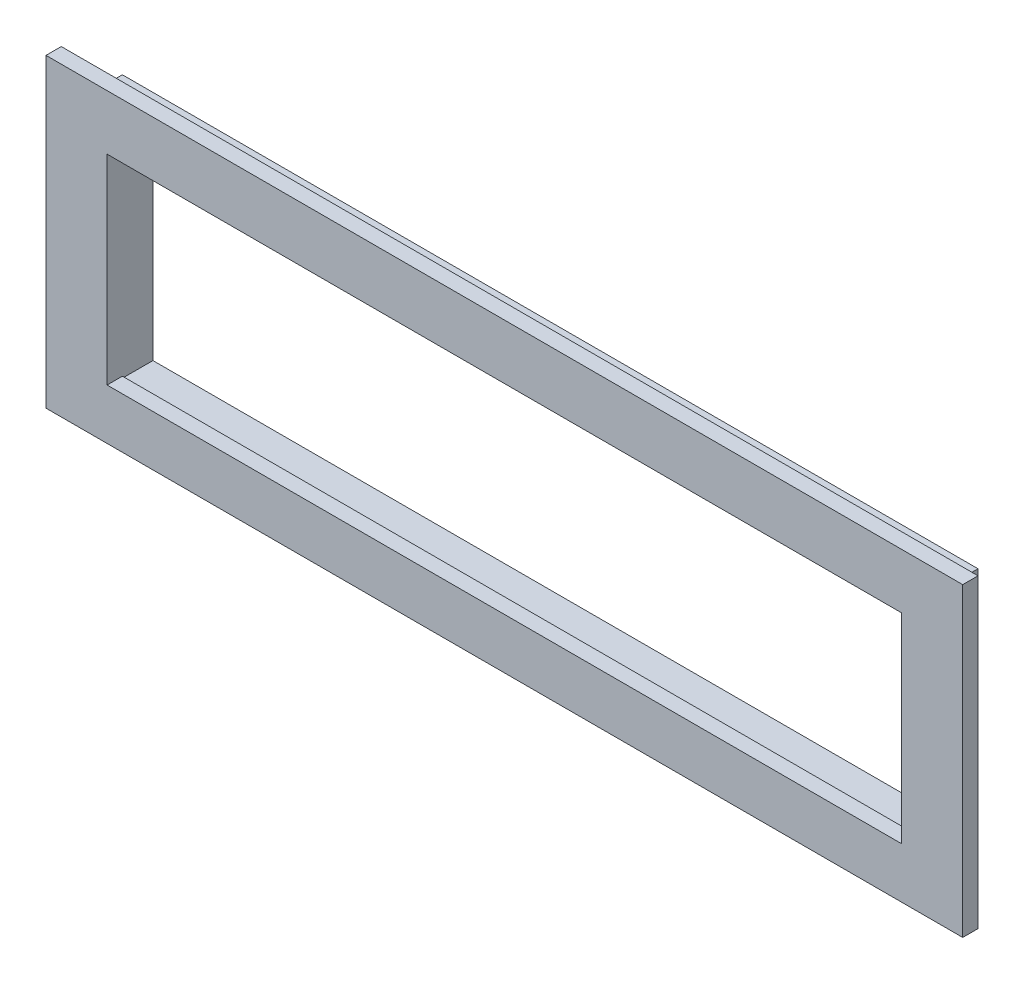
ISO-10303-21;
HEADER;
FILE_DESCRIPTION(('STEP AP214'),'2;1');
FILE_NAME('part.step','',(''),(''),'','','');
FILE_SCHEMA(('AUTOMOTIVE_DESIGN { 1 0 10303 214 1 1 1 1 }'));
ENDSEC;
DATA;
#1=APPLICATION_CONTEXT('core data for automotive mechanical design processes');
#2=APPLICATION_PROTOCOL_DEFINITION('international standard','automotive_design',2000,#1);
#3=PRODUCT_CONTEXT('',#1,'mechanical');
#4=PRODUCT('Part','Part','',(#3));
#5=PRODUCT_RELATED_PRODUCT_CATEGORY('part','',(#4));
#6=PRODUCT_DEFINITION_FORMATION('','',#4);
#7=PRODUCT_DEFINITION_CONTEXT('part definition',#1,'design');
#8=PRODUCT_DEFINITION('design','',#6,#7);
#9=PRODUCT_DEFINITION_SHAPE('','',#8);
#10=(LENGTH_UNIT() NAMED_UNIT(*) SI_UNIT(.MILLI.,.METRE.));
#11=(NAMED_UNIT(*) PLANE_ANGLE_UNIT() SI_UNIT($,.RADIAN.));
#12=(NAMED_UNIT(*) SI_UNIT($,.STERADIAN.) SOLID_ANGLE_UNIT());
#13=UNCERTAINTY_MEASURE_WITH_UNIT(LENGTH_MEASURE(1.E-05),#10,'distance_accuracy_value','');
#14=(GEOMETRIC_REPRESENTATION_CONTEXT(3) GLOBAL_UNCERTAINTY_ASSIGNED_CONTEXT((#13)) GLOBAL_UNIT_ASSIGNED_CONTEXT((#10,
#11,#12)) REPRESENTATION_CONTEXT('',''));
#15=CARTESIAN_POINT('',(0.,0.,0.));
#16=DIRECTION('',(0.,0.,1.));
#17=DIRECTION('',(1.,0.,0.));
#18=AXIS2_PLACEMENT_3D('',#15,#16,#17);
#19=CARTESIAN_POINT('',(-35.5883767982531,-24.6890043849986,-1.));
#20=DIRECTION('',(-1.,0.,0.));
#21=DIRECTION('',(0.,0.,1.));
#22=AXIS2_PLACEMENT_3D('',#19,#20,#21);
#23=PLANE('',#22);
#24=DIRECTION('',(0.,-1.,0.));
#25=VECTOR('',#24,1.);
#26=CARTESIAN_POINT('',(-35.5883767982531,-24.6890043849986,0.));
#27=LINE('',#26,#25);
#28=CARTESIAN_POINT('',(-35.5883767982531,-16.0890043849986,0.));
#29=VERTEX_POINT('',#28);
#30=CARTESIAN_POINT('',(-35.5883767982531,-24.6890043849986,0.));
#31=VERTEX_POINT('',#30);
#32=EDGE_CURVE('E225',#29,#31,#27,.T.);
#33=ORIENTED_EDGE('',*,*,#32,.F.);
#34=DIRECTION('',(0.,0.,1.));
#35=VECTOR('',#34,1.);
#36=CARTESIAN_POINT('',(-35.5883767982531,-16.0890043849986,-1.));
#37=LINE('',#36,#35);
#38=CARTESIAN_POINT('',(-35.5883767982531,-16.0890043849986,-1.));
#39=VERTEX_POINT('',#38);
#40=EDGE_CURVE('E11',#39,#29,#37,.T.);
#41=ORIENTED_EDGE('',*,*,#40,.F.);
#42=DIRECTION('',(0.,-1.,0.));
#43=VECTOR('',#42,1.);
#44=CARTESIAN_POINT('',(-35.5883767982531,-24.6890043849986,-1.));
#45=LINE('',#44,#43);
#46=CARTESIAN_POINT('',(-35.5883767982531,-24.6890043849986,-1.));
#47=VERTEX_POINT('',#46);
#48=EDGE_CURVE('E230',#39,#47,#45,.T.);
#49=ORIENTED_EDGE('',*,*,#48,.T.);
#50=DIRECTION('',(0.,0.,1.));
#51=VECTOR('',#50,1.);
#52=CARTESIAN_POINT('',(-35.5883767982531,-24.6890043849986,-1.));
#53=LINE('',#52,#51);
#54=EDGE_CURVE('E36',#47,#31,#53,.T.);
#55=ORIENTED_EDGE('',*,*,#54,.T.);
#56=EDGE_LOOP('',(#33,#41,#49,#55));
#57=FACE_BOUND('',#56,.T.);
#58=ADVANCED_FACE('F33',(#57),#23,.T.);
#59=CARTESIAN_POINT('',(-35.5883767982531,-16.0890043849986,-1.));
#60=DIRECTION('',(0.,1.,0.));
#61=DIRECTION('',(0.,0.,1.));
#62=AXIS2_PLACEMENT_3D('',#59,#60,#61);
#63=PLANE('',#62);
#64=DIRECTION('',(-1.,0.,0.));
#65=VECTOR('',#64,1.);
#66=CARTESIAN_POINT('',(-35.5883767982531,-16.0890043849986,0.));
#67=LINE('',#66,#65);
#68=CARTESIAN_POINT('',(-7.58837679825324,-16.0890043849986,0.));
#69=VERTEX_POINT('',#68);
#70=EDGE_CURVE('E233',#69,#29,#67,.T.);
#71=ORIENTED_EDGE('',*,*,#70,.F.);
#72=DIRECTION('',(0.,0.,1.));
#73=VECTOR('',#72,1.);
#74=CARTESIAN_POINT('',(-7.58837679825324,-16.0890043849986,-1.));
#75=LINE('',#74,#73);
#76=CARTESIAN_POINT('',(-7.58837679825324,-16.0890043849986,-1.));
#77=VERTEX_POINT('',#76);
#78=EDGE_CURVE('E41',#77,#69,#75,.T.);
#79=ORIENTED_EDGE('',*,*,#78,.F.);
#80=DIRECTION('',(-1.,0.,0.));
#81=VECTOR('',#80,1.);
#82=CARTESIAN_POINT('',(-35.5883767982531,-16.0890043849986,-1.));
#83=LINE('',#82,#81);
#84=EDGE_CURVE('E237',#77,#39,#83,.T.);
#85=ORIENTED_EDGE('',*,*,#84,.T.);
#86=ORIENTED_EDGE('',*,*,#40,.T.);
#87=EDGE_LOOP('',(#71,#79,#85,#86));
#88=FACE_BOUND('',#87,.T.);
#89=ADVANCED_FACE('F255',(#88),#63,.T.);
#90=CARTESIAN_POINT('',(-7.58837679825324,-24.6890043849986,-1.));
#91=DIRECTION('',(1.,0.,0.));
#92=DIRECTION('',(0.,0.,-1.));
#93=AXIS2_PLACEMENT_3D('',#90,#91,#92);
#94=PLANE('',#93);
#95=DIRECTION('',(0.,1.,0.));
#96=VECTOR('',#95,1.);
#97=CARTESIAN_POINT('',(-7.58837679825324,-24.6890043849986,0.));
#98=LINE('',#97,#96);
#99=CARTESIAN_POINT('',(-7.58837679825324,-24.6890043849986,0.));
#100=VERTEX_POINT('',#99);
#101=EDGE_CURVE('E245',#100,#69,#98,.T.);
#102=ORIENTED_EDGE('',*,*,#101,.F.);
#103=DIRECTION('',(0.,0.,1.));
#104=VECTOR('',#103,1.);
#105=CARTESIAN_POINT('',(-7.58837679825324,-24.6890043849986,-1.));
#106=LINE('',#105,#104);
#107=CARTESIAN_POINT('',(-7.58837679825324,-24.6890043849986,-1.));
#108=VERTEX_POINT('',#107);
#109=EDGE_CURVE('E250',#108,#100,#106,.T.);
#110=ORIENTED_EDGE('',*,*,#109,.F.);
#111=DIRECTION('',(0.,1.,0.));
#112=VECTOR('',#111,1.);
#113=CARTESIAN_POINT('',(-7.58837679825324,-24.6890043849986,-1.));
#114=LINE('',#113,#112);
#115=EDGE_CURVE('E235',#108,#77,#114,.T.);
#116=ORIENTED_EDGE('',*,*,#115,.T.);
#117=ORIENTED_EDGE('',*,*,#78,.T.);
#118=EDGE_LOOP('',(#102,#110,#116,#117));
#119=FACE_BOUND('',#118,.T.);
#120=ADVANCED_FACE('F260',(#119),#94,.T.);
#121=CARTESIAN_POINT('',(-35.5883767982531,-24.6890043849986,-1.));
#122=DIRECTION('',(0.,-1.,0.));
#123=DIRECTION('',(0.,0.,-1.));
#124=AXIS2_PLACEMENT_3D('',#121,#122,#123);
#125=PLANE('',#124);
#126=DIRECTION('',(1.,0.,0.));
#127=VECTOR('',#126,1.);
#128=CARTESIAN_POINT('',(-35.5883767982531,-24.6890043849986,0.));
#129=LINE('',#128,#127);
#130=EDGE_CURVE('E242',#31,#100,#129,.T.);
#131=ORIENTED_EDGE('',*,*,#130,.F.);
#132=ORIENTED_EDGE('',*,*,#54,.F.);
#133=DIRECTION('',(1.,0.,0.));
#134=VECTOR('',#133,1.);
#135=CARTESIAN_POINT('',(-35.5883767982531,-24.6890043849986,-1.));
#136=LINE('',#135,#134);
#137=EDGE_CURVE('E232',#47,#108,#136,.T.);
#138=ORIENTED_EDGE('',*,*,#137,.T.);
#139=ORIENTED_EDGE('',*,*,#109,.T.);
#140=EDGE_LOOP('',(#131,#132,#138,#139));
#141=FACE_BOUND('',#140,.T.);
#142=ADVANCED_FACE('F251',(#141),#125,.T.);
#143=CARTESIAN_POINT('',(0.,0.,-1.));
#144=DIRECTION('',(0.,0.,-1.));
#145=DIRECTION('',(-1.,0.,0.));
#146=AXIS2_PLACEMENT_3D('',#143,#144,#145);
#147=PLANE('',#146);
#148=DIRECTION('',(0.,-1.,0.));
#149=VECTOR('',#148,1.);
#150=CARTESIAN_POINT('',(-34.5883767982532,-17.0890043849986,-1.));
#151=LINE('',#150,#149);
#152=CARTESIAN_POINT('',(-34.5883767982532,-17.0890043849986,-1.));
#153=VERTEX_POINT('',#152);
#154=CARTESIAN_POINT('',(-34.5883767982532,-23.6890043849986,-1.));
#155=VERTEX_POINT('',#154);
#156=EDGE_CURVE('E209',#153,#155,#151,.T.);
#157=ORIENTED_EDGE('',*,*,#156,.T.);
#158=DIRECTION('',(1.,0.,0.));
#159=VECTOR('',#158,1.);
#160=CARTESIAN_POINT('',(-8.58837679825319,-23.6890043849986,-1.));
#161=LINE('',#160,#159);
#162=CARTESIAN_POINT('',(-8.58837679825319,-23.6890043849986,-1.));
#163=VERTEX_POINT('',#162);
#164=EDGE_CURVE('E212',#155,#163,#161,.T.);
#165=ORIENTED_EDGE('',*,*,#164,.T.);
#166=DIRECTION('',(0.,1.,0.));
#167=VECTOR('',#166,1.);
#168=CARTESIAN_POINT('',(-8.58837679825318,-17.0890043849986,-1.));
#169=LINE('',#168,#167);
#170=CARTESIAN_POINT('',(-8.58837679825318,-17.0890043849986,-1.));
#171=VERTEX_POINT('',#170);
#172=EDGE_CURVE('E49',#163,#171,#169,.T.);
#173=ORIENTED_EDGE('',*,*,#172,.T.);
#174=DIRECTION('',(-1.,0.,0.));
#175=VECTOR('',#174,1.);
#176=CARTESIAN_POINT('',(-8.58837679825318,-17.0890043849986,-1.));
#177=LINE('',#176,#175);
#178=EDGE_CURVE('E150',#171,#153,#177,.T.);
#179=ORIENTED_EDGE('',*,*,#178,.T.);
#180=EDGE_LOOP('',(#157,#165,#173,#179));
#181=FACE_BOUND('',#180,.T.);
#182=ORIENTED_EDGE('',*,*,#48,.F.);
#183=ORIENTED_EDGE('',*,*,#84,.F.);
#184=ORIENTED_EDGE('',*,*,#115,.F.);
#185=ORIENTED_EDGE('',*,*,#137,.F.);
#186=EDGE_LOOP('',(#182,#183,#184,#185));
#187=FACE_BOUND('',#186,.T.);
#188=ADVANCED_FACE('F259',(#181,#187),#147,.T.);
#189=CARTESIAN_POINT('',(-34.5883767982532,-17.0890043849986,-1.));
#190=DIRECTION('',(-1.,0.,0.));
#191=DIRECTION('',(0.,0.,1.));
#192=AXIS2_PLACEMENT_3D('',#189,#190,#191);
#193=PLANE('',#192);
#194=DIRECTION('',(0.,0.,1.));
#195=VECTOR('',#194,1.);
#196=CARTESIAN_POINT('',(-34.5883767982532,-17.0890043849986,-1.));
#197=LINE('',#196,#195);
#198=CARTESIAN_POINT('',(-34.5883767982532,-17.0890043849986,0.5));
#199=VERTEX_POINT('',#198);
#200=EDGE_CURVE('E151',#153,#199,#197,.T.);
#201=ORIENTED_EDGE('',*,*,#200,.T.);
#202=DIRECTION('',(0.,-1.,0.));
#203=VECTOR('',#202,1.);
#204=CARTESIAN_POINT('',(-34.5883767982532,-23.6320262448859,0.5));
#205=LINE('',#204,#203);
#206=CARTESIAN_POINT('',(-34.5883767982532,-23.6320262448859,0.5));
#207=VERTEX_POINT('',#206);
#208=EDGE_CURVE('E166',#199,#207,#205,.T.);
#209=ORIENTED_EDGE('',*,*,#208,.T.);
#210=DIRECTION('',(0.,0.,-1.));
#211=VECTOR('',#210,1.);
#212=CARTESIAN_POINT('',(-34.5883767982532,-23.6320262448859,0.5));
#213=LINE('',#212,#211);
#214=CARTESIAN_POINT('',(-34.5883767982532,-23.6320262448859,0.));
#215=VERTEX_POINT('',#214);
#216=EDGE_CURVE('E175',#207,#215,#213,.T.);
#217=ORIENTED_EDGE('',*,*,#216,.T.);
#218=DIRECTION('',(0.,-1.,0.));
#219=VECTOR('',#218,1.);
#220=CARTESIAN_POINT('',(-34.5883767982532,-17.0890043849986,0.));
#221=LINE('',#220,#219);
#222=CARTESIAN_POINT('',(-34.5883767982532,-23.6890043849986,0.));
#223=VERTEX_POINT('',#222);
#224=EDGE_CURVE('E208',#215,#223,#221,.T.);
#225=ORIENTED_EDGE('',*,*,#224,.T.);
#226=DIRECTION('',(0.,0.,1.));
#227=VECTOR('',#226,1.);
#228=CARTESIAN_POINT('',(-34.5883767982532,-23.6890043849986,-1.));
#229=LINE('',#228,#227);
#230=EDGE_CURVE('E218',#155,#223,#229,.T.);
#231=ORIENTED_EDGE('',*,*,#230,.F.);
#232=ORIENTED_EDGE('',*,*,#156,.F.);
#233=EDGE_LOOP('',(#201,#209,#217,#225,#231,#232));
#234=FACE_BOUND('',#233,.T.);
#235=ADVANCED_FACE('F288',(#234),#193,.F.);
#236=CARTESIAN_POINT('',(-8.58837679825318,-17.0890043849986,-1.));
#237=DIRECTION('',(0.,1.,0.));
#238=DIRECTION('',(-1.,0.,0.));
#239=AXIS2_PLACEMENT_3D('',#236,#237,#238);
#240=PLANE('',#239);
#241=DIRECTION('',(0.,0.,1.));
#242=VECTOR('',#241,1.);
#243=CARTESIAN_POINT('',(-8.58837679825318,-17.0890043849986,-1.));
#244=LINE('',#243,#242);
#245=CARTESIAN_POINT('',(-8.58837679825319,-17.0890043849986,0.5));
#246=VERTEX_POINT('',#245);
#247=EDGE_CURVE('E143',#171,#246,#244,.T.);
#248=ORIENTED_EDGE('',*,*,#247,.T.);
#249=DIRECTION('',(-1.,0.,0.));
#250=VECTOR('',#249,1.);
#251=CARTESIAN_POINT('',(-8.58837679825319,-17.0890043849986,0.5));
#252=LINE('',#251,#250);
#253=EDGE_CURVE('E147',#246,#199,#252,.T.);
#254=ORIENTED_EDGE('',*,*,#253,.T.);
#255=ORIENTED_EDGE('',*,*,#200,.F.);
#256=ORIENTED_EDGE('',*,*,#178,.F.);
#257=EDGE_LOOP('',(#248,#254,#255,#256));
#258=FACE_BOUND('',#257,.T.);
#259=ADVANCED_FACE('F145',(#258),#240,.F.);
#260=CARTESIAN_POINT('',(-8.58837679825318,-17.0890043849986,-1.));
#261=DIRECTION('',(1.,0.,0.));
#262=DIRECTION('',(0.,1.,0.));
#263=AXIS2_PLACEMENT_3D('',#260,#261,#262);
#264=PLANE('',#263);
#265=DIRECTION('',(0.,1.,0.));
#266=VECTOR('',#265,1.);
#267=CARTESIAN_POINT('',(-8.58837679825318,-17.0890043849986,0.));
#268=LINE('',#267,#266);
#269=CARTESIAN_POINT('',(-8.58837679825319,-23.6890043849986,0.));
#270=VERTEX_POINT('',#269);
#271=CARTESIAN_POINT('',(-8.58837679825319,-23.6320262448859,0.));
#272=VERTEX_POINT('',#271);
#273=EDGE_CURVE('E213',#270,#272,#268,.T.);
#274=ORIENTED_EDGE('',*,*,#273,.T.);
#275=DIRECTION('',(0.,0.,-1.));
#276=VECTOR('',#275,1.);
#277=CARTESIAN_POINT('',(-8.58837679825319,-23.6320262448859,0.5));
#278=LINE('',#277,#276);
#279=CARTESIAN_POINT('',(-8.58837679825319,-23.6320262448859,0.5));
#280=VERTEX_POINT('',#279);
#281=EDGE_CURVE('E159',#280,#272,#278,.T.);
#282=ORIENTED_EDGE('',*,*,#281,.F.);
#283=DIRECTION('',(0.,1.,0.));
#284=VECTOR('',#283,1.);
#285=CARTESIAN_POINT('',(-8.58837679825319,-23.6320262448859,0.5));
#286=LINE('',#285,#284);
#287=EDGE_CURVE('E156',#280,#246,#286,.T.);
#288=ORIENTED_EDGE('',*,*,#287,.T.);
#289=ORIENTED_EDGE('',*,*,#247,.F.);
#290=ORIENTED_EDGE('',*,*,#172,.F.);
#291=DIRECTION('',(0.,0.,1.));
#292=VECTOR('',#291,1.);
#293=CARTESIAN_POINT('',(-8.58837679825319,-23.6890043849986,-1.));
#294=LINE('',#293,#292);
#295=EDGE_CURVE('E152',#163,#270,#294,.T.);
#296=ORIENTED_EDGE('',*,*,#295,.T.);
#297=EDGE_LOOP('',(#274,#282,#288,#289,#290,#296));
#298=FACE_BOUND('',#297,.T.);
#299=ADVANCED_FACE('F158',(#298),#264,.F.);
#300=CARTESIAN_POINT('',(-8.58837679825319,-23.6890043849986,-1.));
#301=DIRECTION('',(0.,-1.,0.));
#302=DIRECTION('',(1.,0.,0.));
#303=AXIS2_PLACEMENT_3D('',#300,#301,#302);
#304=PLANE('',#303);
#305=DIRECTION('',(1.,0.,0.));
#306=VECTOR('',#305,1.);
#307=CARTESIAN_POINT('',(-8.58837679825319,-23.6890043849986,0.));
#308=LINE('',#307,#306);
#309=EDGE_CURVE('E221',#223,#270,#308,.T.);
#310=ORIENTED_EDGE('',*,*,#309,.T.);
#311=ORIENTED_EDGE('',*,*,#295,.F.);
#312=ORIENTED_EDGE('',*,*,#164,.F.);
#313=ORIENTED_EDGE('',*,*,#230,.T.);
#314=EDGE_LOOP('',(#310,#311,#312,#313));
#315=FACE_BOUND('',#314,.T.);
#316=ADVANCED_FACE('F314',(#315),#304,.F.);
#317=CARTESIAN_POINT('',(0.,0.,0.));
#318=DIRECTION('',(0.,0.,1.));
#319=DIRECTION('',(1.,0.,0.));
#320=AXIS2_PLACEMENT_3D('',#317,#318,#319);
#321=PLANE('',#320);
#322=DIRECTION('',(0.,1.,0.));
#323=VECTOR('',#322,1.);
#324=CARTESIAN_POINT('',(-6.58837679825324,-25.2890043849986,0.));
#325=LINE('',#324,#323);
#326=CARTESIAN_POINT('',(-6.58837679825324,-25.2890043849986,0.));
#327=VERTEX_POINT('',#326);
#328=CARTESIAN_POINT('',(-6.58837679825324,-15.2890043849986,0.));
#329=VERTEX_POINT('',#328);
#330=EDGE_CURVE('E178',#327,#329,#325,.T.);
#331=ORIENTED_EDGE('',*,*,#330,.F.);
#332=DIRECTION('',(1.,0.,0.));
#333=VECTOR('',#332,1.);
#334=CARTESIAN_POINT('',(-6.58837679825324,-25.2890043849986,0.));
#335=LINE('',#334,#333);
#336=CARTESIAN_POINT('',(-36.5883767982531,-25.2890043849986,0.));
#337=VERTEX_POINT('',#336);
#338=EDGE_CURVE('E183',#337,#327,#335,.T.);
#339=ORIENTED_EDGE('',*,*,#338,.F.);
#340=DIRECTION('',(0.,-1.,0.));
#341=VECTOR('',#340,1.);
#342=CARTESIAN_POINT('',(-36.5883767982531,-25.2890043849986,0.));
#343=LINE('',#342,#341);
#344=CARTESIAN_POINT('',(-36.5883767982531,-15.2890043849986,0.));
#345=VERTEX_POINT('',#344);
#346=EDGE_CURVE('E194',#345,#337,#343,.T.);
#347=ORIENTED_EDGE('',*,*,#346,.F.);
#348=DIRECTION('',(-1.,0.,0.));
#349=VECTOR('',#348,1.);
#350=CARTESIAN_POINT('',(-6.58837679825324,-15.2890043849986,0.));
#351=LINE('',#350,#349);
#352=EDGE_CURVE('E192',#329,#345,#351,.T.);
#353=ORIENTED_EDGE('',*,*,#352,.F.);
#354=EDGE_LOOP('',(#331,#339,#347,#353));
#355=FACE_BOUND('',#354,.T.);
#356=ORIENTED_EDGE('',*,*,#70,.T.);
#357=ORIENTED_EDGE('',*,*,#32,.T.);
#358=ORIENTED_EDGE('',*,*,#130,.T.);
#359=ORIENTED_EDGE('',*,*,#101,.T.);
#360=EDGE_LOOP('',(#356,#357,#358,#359));
#361=FACE_BOUND('',#360,.T.);
#362=ADVANCED_FACE('F253',(#355,#361),#321,.F.);
#363=CARTESIAN_POINT('',(0.,0.,0.5));
#364=DIRECTION('',(0.,0.,1.));
#365=DIRECTION('',(1.,0.,0.));
#366=AXIS2_PLACEMENT_3D('',#363,#364,#365);
#367=PLANE('',#366);
#368=DIRECTION('',(0.,1.,0.));
#369=VECTOR('',#368,1.);
#370=CARTESIAN_POINT('',(-6.58837679825324,-25.2890043849986,0.5));
#371=LINE('',#370,#369);
#372=CARTESIAN_POINT('',(-6.58837679825324,-25.2890043849986,0.5));
#373=VERTEX_POINT('',#372);
#374=CARTESIAN_POINT('',(-6.58837679825324,-15.2890043849986,0.5));
#375=VERTEX_POINT('',#374);
#376=EDGE_CURVE('E179',#373,#375,#371,.T.);
#377=ORIENTED_EDGE('',*,*,#376,.T.);
#378=DIRECTION('',(-1.,0.,0.));
#379=VECTOR('',#378,1.);
#380=CARTESIAN_POINT('',(-6.58837679825324,-15.2890043849986,0.5));
#381=LINE('',#380,#379);
#382=CARTESIAN_POINT('',(-36.5883767982531,-15.2890043849986,0.5));
#383=VERTEX_POINT('',#382);
#384=EDGE_CURVE('E182',#375,#383,#381,.T.);
#385=ORIENTED_EDGE('',*,*,#384,.T.);
#386=DIRECTION('',(0.,-1.,0.));
#387=VECTOR('',#386,1.);
#388=CARTESIAN_POINT('',(-36.5883767982531,-25.2890043849986,0.5));
#389=LINE('',#388,#387);
#390=CARTESIAN_POINT('',(-36.5883767982531,-25.2890043849986,0.5));
#391=VERTEX_POINT('',#390);
#392=EDGE_CURVE('E185',#383,#391,#389,.T.);
#393=ORIENTED_EDGE('',*,*,#392,.T.);
#394=DIRECTION('',(1.,0.,0.));
#395=VECTOR('',#394,1.);
#396=CARTESIAN_POINT('',(-6.58837679825324,-25.2890043849986,0.5));
#397=LINE('',#396,#395);
#398=EDGE_CURVE('E187',#391,#373,#397,.T.);
#399=ORIENTED_EDGE('',*,*,#398,.T.);
#400=EDGE_LOOP('',(#377,#385,#393,#399));
#401=FACE_BOUND('',#400,.T.);
#402=ORIENTED_EDGE('',*,*,#253,.F.);
#403=ORIENTED_EDGE('',*,*,#287,.F.);
#404=DIRECTION('',(1.,0.,0.));
#405=VECTOR('',#404,1.);
#406=CARTESIAN_POINT('',(-8.58837679825319,-23.6320262448859,0.5));
#407=LINE('',#406,#405);
#408=EDGE_CURVE('E168',#207,#280,#407,.T.);
#409=ORIENTED_EDGE('',*,*,#408,.F.);
#410=ORIENTED_EDGE('',*,*,#208,.F.);
#411=EDGE_LOOP('',(#402,#403,#409,#410));
#412=FACE_BOUND('',#411,.T.);
#413=ADVANCED_FACE('F164',(#401,#412),#367,.T.);
#414=ORIENTED_EDGE('',*,*,#224,.F.);
#415=DIRECTION('',(1.,0.,0.));
#416=VECTOR('',#415,1.);
#417=CARTESIAN_POINT('',(-8.58837679825319,-23.6320262448859,0.));
#418=LINE('',#417,#416);
#419=EDGE_CURVE('E162',#215,#272,#418,.T.);
#420=ORIENTED_EDGE('',*,*,#419,.T.);
#421=ORIENTED_EDGE('',*,*,#273,.F.);
#422=ORIENTED_EDGE('',*,*,#309,.F.);
#423=EDGE_LOOP('',(#414,#420,#421,#422));
#424=FACE_BOUND('',#423,.T.);
#425=ADVANCED_FACE('F331',(#424),#321,.F.);
#426=CARTESIAN_POINT('',(-6.58837679825324,-25.2890043849986,0.5));
#427=DIRECTION('',(-1.,0.,0.));
#428=DIRECTION('',(0.,0.,1.));
#429=AXIS2_PLACEMENT_3D('',#426,#427,#428);
#430=PLANE('',#429);
#431=ORIENTED_EDGE('',*,*,#330,.T.);
#432=DIRECTION('',(0.,0.,-1.));
#433=VECTOR('',#432,1.);
#434=CARTESIAN_POINT('',(-6.58837679825324,-15.2890043849986,0.5));
#435=LINE('',#434,#433);
#436=EDGE_CURVE('E205',#375,#329,#435,.T.);
#437=ORIENTED_EDGE('',*,*,#436,.F.);
#438=ORIENTED_EDGE('',*,*,#376,.F.);
#439=DIRECTION('',(0.,0.,-1.));
#440=VECTOR('',#439,1.);
#441=CARTESIAN_POINT('',(-6.58837679825324,-25.2890043849986,0.5));
#442=LINE('',#441,#440);
#443=EDGE_CURVE('E189',#373,#327,#442,.T.);
#444=ORIENTED_EDGE('',*,*,#443,.T.);
#445=EDGE_LOOP('',(#431,#437,#438,#444));
#446=FACE_BOUND('',#445,.T.);
#447=ADVANCED_FACE('F344',(#446),#430,.F.);
#448=CARTESIAN_POINT('',(-6.58837679825324,-15.2890043849986,0.5));
#449=DIRECTION('',(0.,-1.,0.));
#450=DIRECTION('',(0.,0.,-1.));
#451=AXIS2_PLACEMENT_3D('',#448,#449,#450);
#452=PLANE('',#451);
#453=ORIENTED_EDGE('',*,*,#352,.T.);
#454=DIRECTION('',(0.,0.,-1.));
#455=VECTOR('',#454,1.);
#456=CARTESIAN_POINT('',(-36.5883767982531,-15.2890043849986,0.5));
#457=LINE('',#456,#455);
#458=EDGE_CURVE('E202',#383,#345,#457,.T.);
#459=ORIENTED_EDGE('',*,*,#458,.F.);
#460=ORIENTED_EDGE('',*,*,#384,.F.);
#461=ORIENTED_EDGE('',*,*,#436,.T.);
#462=EDGE_LOOP('',(#453,#459,#460,#461));
#463=FACE_BOUND('',#462,.T.);
#464=ADVANCED_FACE('F351',(#463),#452,.F.);
#465=CARTESIAN_POINT('',(-36.5883767982531,-25.2890043849986,0.5));
#466=DIRECTION('',(1.,0.,0.));
#467=DIRECTION('',(0.,0.,-1.));
#468=AXIS2_PLACEMENT_3D('',#465,#466,#467);
#469=PLANE('',#468);
#470=ORIENTED_EDGE('',*,*,#346,.T.);
#471=DIRECTION('',(0.,0.,-1.));
#472=VECTOR('',#471,1.);
#473=CARTESIAN_POINT('',(-36.5883767982531,-25.2890043849986,0.5));
#474=LINE('',#473,#472);
#475=EDGE_CURVE('E199',#391,#337,#474,.T.);
#476=ORIENTED_EDGE('',*,*,#475,.F.);
#477=ORIENTED_EDGE('',*,*,#392,.F.);
#478=ORIENTED_EDGE('',*,*,#458,.T.);
#479=EDGE_LOOP('',(#470,#476,#477,#478));
#480=FACE_BOUND('',#479,.T.);
#481=ADVANCED_FACE('F359',(#480),#469,.F.);
#482=CARTESIAN_POINT('',(-6.58837679825324,-25.2890043849986,0.5));
#483=DIRECTION('',(0.,1.,0.));
#484=DIRECTION('',(0.,0.,1.));
#485=AXIS2_PLACEMENT_3D('',#482,#483,#484);
#486=PLANE('',#485);
#487=ORIENTED_EDGE('',*,*,#338,.T.);
#488=ORIENTED_EDGE('',*,*,#443,.F.);
#489=ORIENTED_EDGE('',*,*,#398,.F.);
#490=ORIENTED_EDGE('',*,*,#475,.T.);
#491=EDGE_LOOP('',(#487,#488,#489,#490));
#492=FACE_BOUND('',#491,.T.);
#493=ADVANCED_FACE('F367',(#492),#486,.F.);
#494=CARTESIAN_POINT('',(-8.58837679825319,-23.6320262448859,0.5));
#495=DIRECTION('',(0.,1.,0.));
#496=DIRECTION('',(0.,0.,1.));
#497=AXIS2_PLACEMENT_3D('',#494,#495,#496);
#498=PLANE('',#497);
#499=ORIENTED_EDGE('',*,*,#419,.F.);
#500=ORIENTED_EDGE('',*,*,#216,.F.);
#501=ORIENTED_EDGE('',*,*,#408,.T.);
#502=ORIENTED_EDGE('',*,*,#281,.T.);
#503=EDGE_LOOP('',(#499,#500,#501,#502));
#504=FACE_BOUND('',#503,.T.);
#505=ADVANCED_FACE('F375',(#504),#498,.T.);
#506=CLOSED_SHELL('',(#58,#89,#120,#142,#188,#235,#259,#299,#316,#362,#413,#425,#447,#464,#481,
#493,#505));
#507=MANIFOLD_SOLID_BREP('B2',#506);
#508=ADVANCED_BREP_SHAPE_REPRESENTATION('',(#18,#507),#14);
#509=SHAPE_DEFINITION_REPRESENTATION(#9,#508);
ENDSEC;
END-ISO-10303-21;
